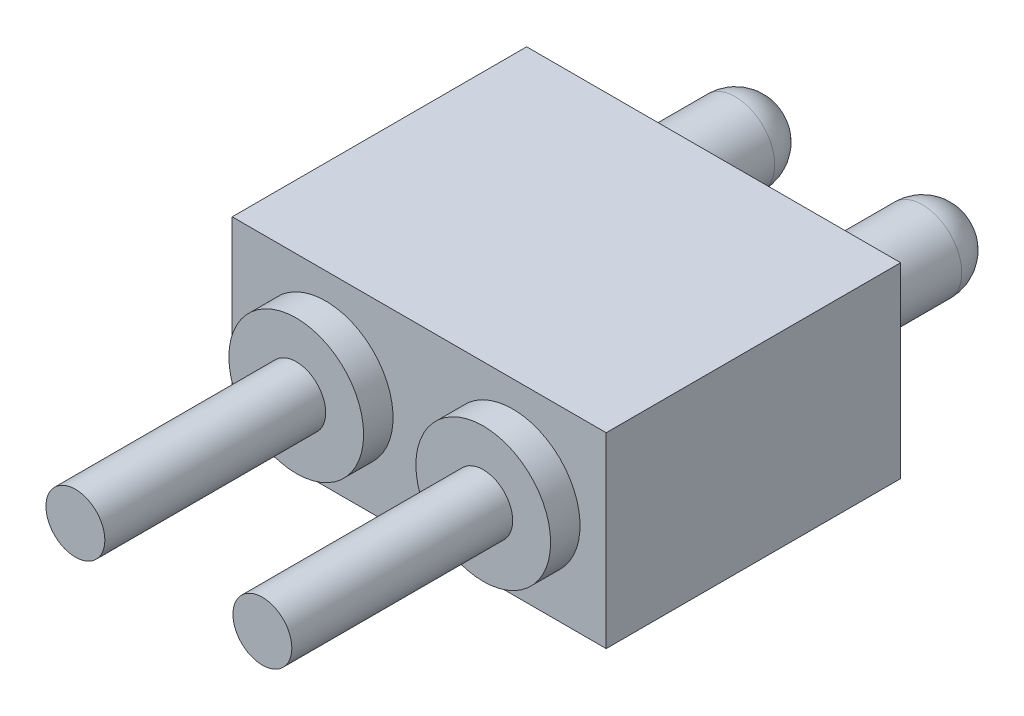
ISO-10303-21;
HEADER;
FILE_DESCRIPTION(('STEP AP214'),'2;1');
FILE_NAME('part.step','',(''),(''),'','','');
FILE_SCHEMA(('AUTOMOTIVE_DESIGN { 1 0 10303 214 1 1 1 1 }'));
ENDSEC;
DATA;
#1=APPLICATION_CONTEXT('core data for automotive mechanical design processes');
#2=APPLICATION_PROTOCOL_DEFINITION('international standard','automotive_design',2000,#1);
#3=PRODUCT_CONTEXT('',#1,'mechanical');
#4=PRODUCT('Part','Part','',(#3));
#5=PRODUCT_RELATED_PRODUCT_CATEGORY('part','',(#4));
#6=PRODUCT_DEFINITION_FORMATION('','',#4);
#7=PRODUCT_DEFINITION_CONTEXT('part definition',#1,'design');
#8=PRODUCT_DEFINITION('design','',#6,#7);
#9=PRODUCT_DEFINITION_SHAPE('','',#8);
#10=(LENGTH_UNIT() NAMED_UNIT(*) SI_UNIT(.MILLI.,.METRE.));
#11=(NAMED_UNIT(*) PLANE_ANGLE_UNIT() SI_UNIT($,.RADIAN.));
#12=(NAMED_UNIT(*) SI_UNIT($,.STERADIAN.) SOLID_ANGLE_UNIT());
#13=UNCERTAINTY_MEASURE_WITH_UNIT(LENGTH_MEASURE(1.E-05),#10,'distance_accuracy_value','');
#14=(GEOMETRIC_REPRESENTATION_CONTEXT(3) GLOBAL_UNCERTAINTY_ASSIGNED_CONTEXT((#13)) GLOBAL_UNIT_ASSIGNED_CONTEXT((#10,
#11,#12)) REPRESENTATION_CONTEXT('',''));
#15=CARTESIAN_POINT('',(0.,0.,0.));
#16=DIRECTION('',(0.,0.,1.));
#17=DIRECTION('',(1.,0.,0.));
#18=AXIS2_PLACEMENT_3D('',#15,#16,#17);
#19=CARTESIAN_POINT('',(1.27,1.27,4.4));
#20=DIRECTION('',(0.,0.,1.));
#21=DIRECTION('',(1.,0.,0.));
#22=AXIS2_PLACEMENT_3D('',#19,#20,#21);
#23=PLANE('',#22);
#24=CARTESIAN_POINT('',(1.27,1.27,4.4));
#25=DIRECTION('',(0.,0.,1.));
#26=DIRECTION('',(1.,0.,0.));
#27=AXIS2_PLACEMENT_3D('',#24,#25,#26);
#28=CIRCLE('',#27,0.915);
#29=CARTESIAN_POINT('',(2.185,1.27,4.4));
#30=VERTEX_POINT('',#29);
#31=EDGE_CURVE('E103',#30,#30,#28,.T.);
#32=ORIENTED_EDGE('',*,*,#31,.T.);
#33=EDGE_LOOP('',(#32));
#34=FACE_BOUND('',#33,.T.);
#35=CARTESIAN_POINT('',(1.27,1.27,4.4));
#36=DIRECTION('',(0.,0.,1.));
#37=DIRECTION('',(1.,0.,0.));
#38=AXIS2_PLACEMENT_3D('',#35,#36,#37);
#39=CIRCLE('',#38,0.4);
#40=CARTESIAN_POINT('',(1.67,1.27,4.4));
#41=VERTEX_POINT('',#40);
#42=EDGE_CURVE('E143',#41,#41,#39,.T.);
#43=ORIENTED_EDGE('',*,*,#42,.F.);
#44=EDGE_LOOP('',(#43));
#45=FACE_BOUND('',#44,.T.);
#46=ADVANCED_FACE('F34',(#34,#45),#23,.T.);
#47=CARTESIAN_POINT('',(3.81,1.27,4.4));
#48=DIRECTION('',(0.,0.,1.));
#49=DIRECTION('',(1.,0.,0.));
#50=AXIS2_PLACEMENT_3D('',#47,#48,#49);
#51=PLANE('',#50);
#52=CARTESIAN_POINT('',(3.81,1.27,4.4));
#53=DIRECTION('',(0.,0.,1.));
#54=DIRECTION('',(1.,0.,0.));
#55=AXIS2_PLACEMENT_3D('',#52,#53,#54);
#56=CIRCLE('',#55,0.915);
#57=CARTESIAN_POINT('',(4.725,1.27,4.4));
#58=VERTEX_POINT('',#57);
#59=EDGE_CURVE('E100',#58,#58,#56,.T.);
#60=ORIENTED_EDGE('',*,*,#59,.T.);
#61=EDGE_LOOP('',(#60));
#62=FACE_BOUND('',#61,.T.);
#63=CARTESIAN_POINT('',(3.81,1.27,4.4));
#64=DIRECTION('',(0.,0.,1.));
#65=DIRECTION('',(1.,0.,0.));
#66=AXIS2_PLACEMENT_3D('',#63,#64,#65);
#67=CIRCLE('',#66,0.4);
#68=CARTESIAN_POINT('',(4.21,1.27,4.4));
#69=VERTEX_POINT('',#68);
#70=EDGE_CURVE('E137',#69,#69,#67,.T.);
#71=ORIENTED_EDGE('',*,*,#70,.F.);
#72=EDGE_LOOP('',(#71));
#73=FACE_BOUND('',#72,.T.);
#74=ADVANCED_FACE('F159',(#62,#73),#51,.T.);
#75=CARTESIAN_POINT('',(0.,2.54,0.));
#76=DIRECTION('',(0.,0.,-1.));
#77=DIRECTION('',(-1.,0.,0.));
#78=AXIS2_PLACEMENT_3D('',#75,#76,#77);
#79=PLANE('',#78);
#80=CARTESIAN_POINT('',(3.81,1.27,0.));
#81=DIRECTION('',(0.,0.,-1.));
#82=DIRECTION('',(-1.,0.,0.));
#83=AXIS2_PLACEMENT_3D('',#80,#81,#82);
#84=CIRCLE('',#83,0.535);
#85=CARTESIAN_POINT('',(3.275,1.27,0.));
#86=VERTEX_POINT('',#85);
#87=EDGE_CURVE('E123',#86,#86,#84,.T.);
#88=ORIENTED_EDGE('',*,*,#87,.F.);
#89=EDGE_LOOP('',(#88));
#90=FACE_BOUND('',#89,.T.);
#91=DIRECTION('',(0.,-1.,0.));
#92=VECTOR('',#91,1.);
#93=CARTESIAN_POINT('',(0.,0.,0.));
#94=LINE('',#93,#92);
#95=CARTESIAN_POINT('',(0.,2.54,0.));
#96=VERTEX_POINT('',#95);
#97=CARTESIAN_POINT('',(0.,0.,0.));
#98=VERTEX_POINT('',#97);
#99=EDGE_CURVE('E83',#96,#98,#94,.T.);
#100=ORIENTED_EDGE('',*,*,#99,.F.);
#101=DIRECTION('',(-1.,0.,0.));
#102=VECTOR('',#101,1.);
#103=CARTESIAN_POINT('',(0.,2.54,0.));
#104=LINE('',#103,#102);
#105=CARTESIAN_POINT('',(5.08,2.54,0.));
#106=VERTEX_POINT('',#105);
#107=EDGE_CURVE('E108',#106,#96,#104,.T.);
#108=ORIENTED_EDGE('',*,*,#107,.F.);
#109=DIRECTION('',(0.,1.,0.));
#110=VECTOR('',#109,1.);
#111=CARTESIAN_POINT('',(5.08,0.,0.));
#112=LINE('',#111,#110);
#113=CARTESIAN_POINT('',(5.08,0.,0.));
#114=VERTEX_POINT('',#113);
#115=EDGE_CURVE('E84',#114,#106,#112,.T.);
#116=ORIENTED_EDGE('',*,*,#115,.F.);
#117=DIRECTION('',(1.,0.,0.));
#118=VECTOR('',#117,1.);
#119=CARTESIAN_POINT('',(0.,0.,0.));
#120=LINE('',#119,#118);
#121=EDGE_CURVE('E77',#98,#114,#120,.T.);
#122=ORIENTED_EDGE('',*,*,#121,.F.);
#123=EDGE_LOOP('',(#100,#108,#116,#122));
#124=FACE_BOUND('',#123,.T.);
#125=CARTESIAN_POINT('',(1.27,1.27,0.));
#126=DIRECTION('',(0.,0.,-1.));
#127=DIRECTION('',(-1.,0.,0.));
#128=AXIS2_PLACEMENT_3D('',#125,#126,#127);
#129=CIRCLE('',#128,0.535);
#130=CARTESIAN_POINT('',(0.735,1.27,0.));
#131=VERTEX_POINT('',#130);
#132=EDGE_CURVE('E132',#131,#131,#129,.T.);
#133=ORIENTED_EDGE('',*,*,#132,.F.);
#134=EDGE_LOOP('',(#133));
#135=FACE_BOUND('',#134,.T.);
#136=ADVANCED_FACE('F79',(#90,#124,#135),#79,.T.);
#137=CARTESIAN_POINT('',(0.,2.54,4.));
#138=DIRECTION('',(0.,0.,-1.));
#139=DIRECTION('',(-1.,0.,0.));
#140=AXIS2_PLACEMENT_3D('',#137,#138,#139);
#141=PLANE('',#140);
#142=CARTESIAN_POINT('',(3.81,1.27,4.));
#143=DIRECTION('',(0.,0.,-1.));
#144=DIRECTION('',(-1.,0.,0.));
#145=AXIS2_PLACEMENT_3D('',#142,#143,#144);
#146=CIRCLE('',#145,0.915);
#147=CARTESIAN_POINT('',(2.895,1.27,4.));
#148=VERTEX_POINT('',#147);
#149=EDGE_CURVE('E43',#148,#148,#146,.F.);
#150=ORIENTED_EDGE('',*,*,#149,.F.);
#151=EDGE_LOOP('',(#150));
#152=FACE_BOUND('',#151,.T.);
#153=DIRECTION('',(0.,-1.,0.));
#154=VECTOR('',#153,1.);
#155=CARTESIAN_POINT('',(0.,0.,4.));
#156=LINE('',#155,#154);
#157=CARTESIAN_POINT('',(0.,2.54,4.));
#158=VERTEX_POINT('',#157);
#159=CARTESIAN_POINT('',(0.,0.,4.));
#160=VERTEX_POINT('',#159);
#161=EDGE_CURVE('E110',#158,#160,#156,.T.);
#162=ORIENTED_EDGE('',*,*,#161,.T.);
#163=DIRECTION('',(1.,0.,0.));
#164=VECTOR('',#163,1.);
#165=CARTESIAN_POINT('',(0.,0.,4.));
#166=LINE('',#165,#164);
#167=CARTESIAN_POINT('',(5.08,0.,4.));
#168=VERTEX_POINT('',#167);
#169=EDGE_CURVE('E92',#160,#168,#166,.T.);
#170=ORIENTED_EDGE('',*,*,#169,.T.);
#171=DIRECTION('',(0.,1.,0.));
#172=VECTOR('',#171,1.);
#173=CARTESIAN_POINT('',(5.08,0.,4.));
#174=LINE('',#173,#172);
#175=CARTESIAN_POINT('',(5.08,2.54,4.));
#176=VERTEX_POINT('',#175);
#177=EDGE_CURVE('E56',#168,#176,#174,.T.);
#178=ORIENTED_EDGE('',*,*,#177,.T.);
#179=DIRECTION('',(-1.,0.,0.));
#180=VECTOR('',#179,1.);
#181=CARTESIAN_POINT('',(0.,2.54,4.));
#182=LINE('',#181,#180);
#183=EDGE_CURVE('E51',#176,#158,#182,.T.);
#184=ORIENTED_EDGE('',*,*,#183,.T.);
#185=EDGE_LOOP('',(#162,#170,#178,#184));
#186=FACE_BOUND('',#185,.T.);
#187=CARTESIAN_POINT('',(1.27,1.27,4.));
#188=DIRECTION('',(0.,0.,-1.));
#189=DIRECTION('',(-1.,0.,0.));
#190=AXIS2_PLACEMENT_3D('',#187,#188,#189);
#191=CIRCLE('',#190,0.915);
#192=CARTESIAN_POINT('',(0.355,1.27,4.));
#193=VERTEX_POINT('',#192);
#194=EDGE_CURVE('E11',#193,#193,#191,.F.);
#195=ORIENTED_EDGE('',*,*,#194,.F.);
#196=EDGE_LOOP('',(#195));
#197=FACE_BOUND('',#196,.T.);
#198=ADVANCED_FACE('F182',(#152,#186,#197),#141,.F.);
#199=CARTESIAN_POINT('',(0.,0.,4.));
#200=DIRECTION('',(1.,0.,0.));
#201=DIRECTION('',(0.,0.,-1.));
#202=AXIS2_PLACEMENT_3D('',#199,#200,#201);
#203=PLANE('',#202);
#204=ORIENTED_EDGE('',*,*,#99,.T.);
#205=DIRECTION('',(0.,0.,-1.));
#206=VECTOR('',#205,1.);
#207=CARTESIAN_POINT('',(0.,0.,4.));
#208=LINE('',#207,#206);
#209=EDGE_CURVE('E90',#160,#98,#208,.T.);
#210=ORIENTED_EDGE('',*,*,#209,.F.);
#211=ORIENTED_EDGE('',*,*,#161,.F.);
#212=DIRECTION('',(0.,0.,-1.));
#213=VECTOR('',#212,1.);
#214=CARTESIAN_POINT('',(0.,2.54,4.));
#215=LINE('',#214,#213);
#216=EDGE_CURVE('E99',#158,#96,#215,.T.);
#217=ORIENTED_EDGE('',*,*,#216,.T.);
#218=EDGE_LOOP('',(#204,#210,#211,#217));
#219=FACE_BOUND('',#218,.T.);
#220=ADVANCED_FACE('F98',(#219),#203,.F.);
#221=CARTESIAN_POINT('',(0.,0.,4.));
#222=DIRECTION('',(0.,1.,0.));
#223=DIRECTION('',(0.,0.,1.));
#224=AXIS2_PLACEMENT_3D('',#221,#222,#223);
#225=PLANE('',#224);
#226=ORIENTED_EDGE('',*,*,#121,.T.);
#227=DIRECTION('',(0.,0.,-1.));
#228=VECTOR('',#227,1.);
#229=CARTESIAN_POINT('',(5.08,0.,4.));
#230=LINE('',#229,#228);
#231=EDGE_CURVE('E95',#168,#114,#230,.T.);
#232=ORIENTED_EDGE('',*,*,#231,.F.);
#233=ORIENTED_EDGE('',*,*,#169,.F.);
#234=ORIENTED_EDGE('',*,*,#209,.T.);
#235=EDGE_LOOP('',(#226,#232,#233,#234));
#236=FACE_BOUND('',#235,.T.);
#237=ADVANCED_FACE('F91',(#236),#225,.F.);
#238=CARTESIAN_POINT('',(5.08,0.,4.));
#239=DIRECTION('',(-1.,0.,0.));
#240=DIRECTION('',(0.,0.,1.));
#241=AXIS2_PLACEMENT_3D('',#238,#239,#240);
#242=PLANE('',#241);
#243=ORIENTED_EDGE('',*,*,#115,.T.);
#244=DIRECTION('',(0.,0.,-1.));
#245=VECTOR('',#244,1.);
#246=CARTESIAN_POINT('',(5.08,2.54,4.));
#247=LINE('',#246,#245);
#248=EDGE_CURVE('E116',#176,#106,#247,.T.);
#249=ORIENTED_EDGE('',*,*,#248,.F.);
#250=ORIENTED_EDGE('',*,*,#177,.F.);
#251=ORIENTED_EDGE('',*,*,#231,.T.);
#252=EDGE_LOOP('',(#243,#249,#250,#251));
#253=FACE_BOUND('',#252,.T.);
#254=ADVANCED_FACE('F189',(#253),#242,.F.);
#255=CARTESIAN_POINT('',(0.,2.54,4.));
#256=DIRECTION('',(0.,-1.,0.));
#257=DIRECTION('',(0.,0.,-1.));
#258=AXIS2_PLACEMENT_3D('',#255,#256,#257);
#259=PLANE('',#258);
#260=ORIENTED_EDGE('',*,*,#107,.T.);
#261=ORIENTED_EDGE('',*,*,#216,.F.);
#262=ORIENTED_EDGE('',*,*,#183,.F.);
#263=ORIENTED_EDGE('',*,*,#248,.T.);
#264=EDGE_LOOP('',(#260,#261,#262,#263));
#265=FACE_BOUND('',#264,.T.);
#266=ADVANCED_FACE('F178',(#265),#259,.F.);
#267=CARTESIAN_POINT('',(3.81,1.27,4.4));
#268=DIRECTION('',(0.,0.,-1.));
#269=DIRECTION('',(-1.,0.,0.));
#270=AXIS2_PLACEMENT_3D('',#267,#268,#269);
#271=CYLINDRICAL_SURFACE('',#270,0.915);
#272=ORIENTED_EDGE('',*,*,#59,.F.);
#273=EDGE_LOOP('',(#272));
#274=FACE_BOUND('',#273,.T.);
#275=ORIENTED_EDGE('',*,*,#149,.T.);
#276=EDGE_LOOP('',(#275));
#277=FACE_BOUND('',#276,.T.);
#278=ADVANCED_FACE('F173',(#274,#277),#271,.T.);
#279=CARTESIAN_POINT('',(1.27,1.27,4.4));
#280=DIRECTION('',(0.,0.,-1.));
#281=DIRECTION('',(-1.,0.,0.));
#282=AXIS2_PLACEMENT_3D('',#279,#280,#281);
#283=CYLINDRICAL_SURFACE('',#282,0.915);
#284=ORIENTED_EDGE('',*,*,#31,.F.);
#285=EDGE_LOOP('',(#284));
#286=FACE_BOUND('',#285,.T.);
#287=ORIENTED_EDGE('',*,*,#194,.T.);
#288=EDGE_LOOP('',(#287));
#289=FACE_BOUND('',#288,.T.);
#290=ADVANCED_FACE('F171',(#286,#289),#283,.T.);
#291=CARTESIAN_POINT('',(3.81,1.27,-1.565));
#292=DIRECTION('',(0.,0.,1.));
#293=DIRECTION('',(1.,0.,0.));
#294=AXIS2_PLACEMENT_3D('',#291,#292,#293);
#295=CYLINDRICAL_SURFACE('',#294,0.535);
#296=CARTESIAN_POINT('',(3.81,1.27,-1.565));
#297=DIRECTION('',(0.,0.,-1.));
#298=DIRECTION('',(-1.,0.,0.));
#299=AXIS2_PLACEMENT_3D('',#296,#297,#298);
#300=CIRCLE('',#299,0.535);
#301=CARTESIAN_POINT('',(3.275,1.27,-1.565));
#302=VERTEX_POINT('',#301);
#303=EDGE_CURVE('E121',#302,#302,#300,.T.);
#304=ORIENTED_EDGE('',*,*,#303,.F.);
#305=EDGE_LOOP('',(#304));
#306=FACE_BOUND('',#305,.T.);
#307=ORIENTED_EDGE('',*,*,#87,.T.);
#308=EDGE_LOOP('',(#307));
#309=FACE_BOUND('',#308,.T.);
#310=ADVANCED_FACE('F169',(#306,#309),#295,.T.);
#311=CARTESIAN_POINT('',(3.81,1.27,-1.565));
#312=DIRECTION('',(0.,0.,1.));
#313=DIRECTION('',(1.,0.,0.));
#314=AXIS2_PLACEMENT_3D('',#311,#312,#313);
#315=SPHERICAL_SURFACE('',#314,0.535);
#316=ORIENTED_EDGE('',*,*,#303,.T.);
#317=EDGE_LOOP('',(#316));
#318=FACE_BOUND('',#317,.T.);
#319=ADVANCED_FACE('F197',(#318),#315,.T.);
#320=CARTESIAN_POINT('',(1.27,1.27,-1.565));
#321=DIRECTION('',(0.,0.,1.));
#322=DIRECTION('',(1.,0.,0.));
#323=AXIS2_PLACEMENT_3D('',#320,#321,#322);
#324=CYLINDRICAL_SURFACE('',#323,0.535);
#325=CARTESIAN_POINT('',(1.27,1.27,-1.565));
#326=DIRECTION('',(0.,0.,-1.));
#327=DIRECTION('',(-1.,0.,0.));
#328=AXIS2_PLACEMENT_3D('',#325,#326,#327);
#329=CIRCLE('',#328,0.535);
#330=CARTESIAN_POINT('',(0.735,1.27,-1.565));
#331=VERTEX_POINT('',#330);
#332=EDGE_CURVE('E38',#331,#331,#329,.T.);
#333=ORIENTED_EDGE('',*,*,#332,.F.);
#334=EDGE_LOOP('',(#333));
#335=FACE_BOUND('',#334,.T.);
#336=ORIENTED_EDGE('',*,*,#132,.T.);
#337=EDGE_LOOP('',(#336));
#338=FACE_BOUND('',#337,.T.);
#339=ADVANCED_FACE('F199',(#335,#338),#324,.T.);
#340=CARTESIAN_POINT('',(1.27,1.27,-1.565));
#341=DIRECTION('',(0.,0.,1.));
#342=DIRECTION('',(1.,0.,0.));
#343=AXIS2_PLACEMENT_3D('',#340,#341,#342);
#344=SPHERICAL_SURFACE('',#343,0.535);
#345=ORIENTED_EDGE('',*,*,#332,.T.);
#346=EDGE_LOOP('',(#345));
#347=FACE_BOUND('',#346,.T.);
#348=ADVANCED_FACE('F36',(#347),#344,.T.);
#349=CARTESIAN_POINT('',(3.81,1.27,7.4));
#350=DIRECTION('',(0.,0.,-1.));
#351=DIRECTION('',(-1.,0.,0.));
#352=AXIS2_PLACEMENT_3D('',#349,#350,#351);
#353=CYLINDRICAL_SURFACE('',#352,0.4);
#354=CARTESIAN_POINT('',(3.81,1.27,7.4));
#355=DIRECTION('',(0.,0.,1.));
#356=DIRECTION('',(1.,0.,0.));
#357=AXIS2_PLACEMENT_3D('',#354,#355,#356);
#358=CIRCLE('',#357,0.4);
#359=CARTESIAN_POINT('',(4.21,1.27,7.4));
#360=VERTEX_POINT('',#359);
#361=EDGE_CURVE('E136',#360,#360,#358,.T.);
#362=ORIENTED_EDGE('',*,*,#361,.F.);
#363=EDGE_LOOP('',(#362));
#364=FACE_BOUND('',#363,.T.);
#365=ORIENTED_EDGE('',*,*,#70,.T.);
#366=EDGE_LOOP('',(#365));
#367=FACE_BOUND('',#366,.T.);
#368=ADVANCED_FACE('F253',(#364,#367),#353,.T.);
#369=CARTESIAN_POINT('',(3.81,1.27,7.4));
#370=DIRECTION('',(0.,0.,1.));
#371=DIRECTION('',(1.,0.,0.));
#372=AXIS2_PLACEMENT_3D('',#369,#370,#371);
#373=PLANE('',#372);
#374=ORIENTED_EDGE('',*,*,#361,.T.);
#375=EDGE_LOOP('',(#374));
#376=FACE_BOUND('',#375,.T.);
#377=ADVANCED_FACE('F154',(#376),#373,.T.);
#378=CARTESIAN_POINT('',(1.27,1.27,7.4));
#379=DIRECTION('',(0.,0.,-1.));
#380=DIRECTION('',(-1.,0.,0.));
#381=AXIS2_PLACEMENT_3D('',#378,#379,#380);
#382=CYLINDRICAL_SURFACE('',#381,0.4);
#383=CARTESIAN_POINT('',(1.27,1.27,7.4));
#384=DIRECTION('',(0.,0.,1.));
#385=DIRECTION('',(1.,0.,0.));
#386=AXIS2_PLACEMENT_3D('',#383,#384,#385);
#387=CIRCLE('',#386,0.4);
#388=CARTESIAN_POINT('',(1.67,1.27,7.4));
#389=VERTEX_POINT('',#388);
#390=EDGE_CURVE('E140',#389,#389,#387,.T.);
#391=ORIENTED_EDGE('',*,*,#390,.F.);
#392=EDGE_LOOP('',(#391));
#393=FACE_BOUND('',#392,.T.);
#394=ORIENTED_EDGE('',*,*,#42,.T.);
#395=EDGE_LOOP('',(#394));
#396=FACE_BOUND('',#395,.T.);
#397=ADVANCED_FACE('F151',(#393,#396),#382,.T.);
#398=CARTESIAN_POINT('',(1.27,1.27,7.4));
#399=DIRECTION('',(0.,0.,1.));
#400=DIRECTION('',(1.,0.,0.));
#401=AXIS2_PLACEMENT_3D('',#398,#399,#400);
#402=PLANE('',#401);
#403=ORIENTED_EDGE('',*,*,#390,.T.);
#404=EDGE_LOOP('',(#403));
#405=FACE_BOUND('',#404,.T.);
#406=ADVANCED_FACE('F149',(#405),#402,.T.);
#407=CLOSED_SHELL('',(#46,#74,#136,#198,#220,#237,#254,#266,#278,#290,#310,#319,#339,#348,#368,
#377,#397,#406));
#408=MANIFOLD_SOLID_BREP('B2',#407);
#409=ADVANCED_BREP_SHAPE_REPRESENTATION('',(#18,#408),#14);
#410=SHAPE_DEFINITION_REPRESENTATION(#9,#409);
ENDSEC;
END-ISO-10303-21;
